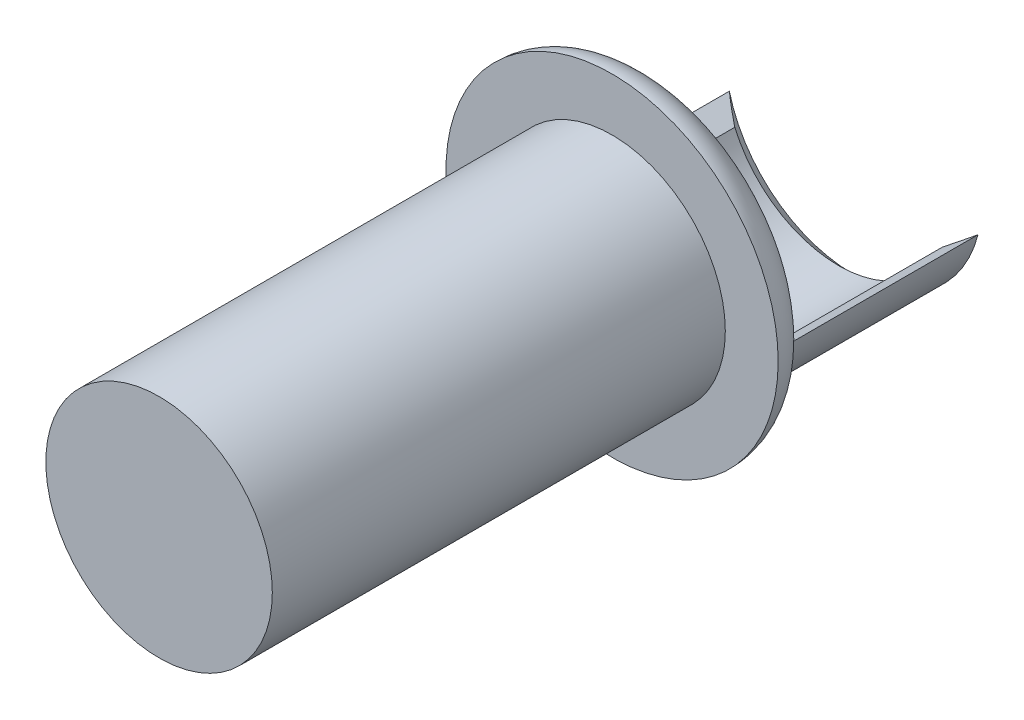
ISO-10303-21;
HEADER;
FILE_DESCRIPTION(('STEP AP214'),'2;1');
FILE_NAME('part.step','',(''),(''),'','','');
FILE_SCHEMA(('AUTOMOTIVE_DESIGN { 1 0 10303 214 1 1 1 1 }'));
ENDSEC;
DATA;
#1=APPLICATION_CONTEXT('core data for automotive mechanical design processes');
#2=APPLICATION_PROTOCOL_DEFINITION('international standard','automotive_design',2000,#1);
#3=PRODUCT_CONTEXT('',#1,'mechanical');
#4=PRODUCT('Part','Part','',(#3));
#5=PRODUCT_RELATED_PRODUCT_CATEGORY('part','',(#4));
#6=PRODUCT_DEFINITION_FORMATION('','',#4);
#7=PRODUCT_DEFINITION_CONTEXT('part definition',#1,'design');
#8=PRODUCT_DEFINITION('design','',#6,#7);
#9=PRODUCT_DEFINITION_SHAPE('','',#8);
#10=(LENGTH_UNIT() NAMED_UNIT(*) SI_UNIT(.MILLI.,.METRE.));
#11=(NAMED_UNIT(*) PLANE_ANGLE_UNIT() SI_UNIT($,.RADIAN.));
#12=(NAMED_UNIT(*) SI_UNIT($,.STERADIAN.) SOLID_ANGLE_UNIT());
#13=UNCERTAINTY_MEASURE_WITH_UNIT(LENGTH_MEASURE(1.E-05),#10,'distance_accuracy_value','');
#14=(GEOMETRIC_REPRESENTATION_CONTEXT(3) GLOBAL_UNCERTAINTY_ASSIGNED_CONTEXT((#13)) GLOBAL_UNIT_ASSIGNED_CONTEXT((#10,
#11,#12)) REPRESENTATION_CONTEXT('',''));
#15=CARTESIAN_POINT('',(0.,0.,0.));
#16=DIRECTION('',(0.,0.,1.));
#17=DIRECTION('',(1.,0.,0.));
#18=AXIS2_PLACEMENT_3D('',#15,#16,#17);
#19=CARTESIAN_POINT('',(0.,0.,65.));
#20=DIRECTION('',(0.,0.,-1.));
#21=DIRECTION('',(-1.,0.,0.));
#22=AXIS2_PLACEMENT_3D('',#19,#20,#21);
#23=CYLINDRICAL_SURFACE('',#22,15.);
#24=CARTESIAN_POINT('',(0.,0.,65.));
#25=DIRECTION('',(0.,0.,1.));
#26=DIRECTION('',(1.,0.,0.));
#27=AXIS2_PLACEMENT_3D('',#24,#25,#26);
#28=CIRCLE('',#27,15.);
#29=CARTESIAN_POINT('',(15.,0.,65.));
#30=VERTEX_POINT('',#29);
#31=EDGE_CURVE('E11',#30,#30,#28,.T.);
#32=ORIENTED_EDGE('',*,*,#31,.F.);
#33=EDGE_LOOP('',(#32));
#34=FACE_BOUND('',#33,.T.);
#35=CARTESIAN_POINT('',(0.,0.,5.));
#36=DIRECTION('',(0.,0.,1.));
#37=DIRECTION('',(1.,0.,0.));
#38=AXIS2_PLACEMENT_3D('',#35,#36,#37);
#39=CIRCLE('',#38,15.);
#40=CARTESIAN_POINT('',(15.,0.,5.));
#41=VERTEX_POINT('',#40);
#42=EDGE_CURVE('E45',#41,#41,#39,.T.);
#43=ORIENTED_EDGE('',*,*,#42,.T.);
#44=EDGE_LOOP('',(#43));
#45=FACE_BOUND('',#44,.T.);
#46=ADVANCED_FACE('F42',(#34,#45),#23,.T.);
#47=CARTESIAN_POINT('',(0.,0.,65.));
#48=DIRECTION('',(0.,0.,1.));
#49=DIRECTION('',(1.,0.,0.));
#50=AXIS2_PLACEMENT_3D('',#47,#48,#49);
#51=PLANE('',#50);
#52=ORIENTED_EDGE('',*,*,#31,.T.);
#53=EDGE_LOOP('',(#52));
#54=FACE_BOUND('',#53,.T.);
#55=ADVANCED_FACE('F57',(#54),#51,.T.);
#56=CARTESIAN_POINT('',(0.,0.,5.));
#57=DIRECTION('',(0.,0.,1.));
#58=DIRECTION('',(1.,0.,0.));
#59=AXIS2_PLACEMENT_3D('',#56,#57,#58);
#60=PLANE('',#59);
#61=ORIENTED_EDGE('',*,*,#42,.F.);
#62=EDGE_LOOP('',(#61));
#63=FACE_BOUND('',#62,.T.);
#64=ADVANCED_FACE('F55',(#63),#60,.F.);
#65=CLOSED_SHELL('',(#46,#55,#64));
#66=MANIFOLD_SOLID_BREP('B2',#65);
#67=CARTESIAN_POINT('',(0.,0.,0.));
#68=DIRECTION('',(0.,0.,1.));
#69=DIRECTION('',(1.,0.,0.));
#70=AXIS2_PLACEMENT_3D('',#67,#68,#69);
#71=PLANE('',#70);
#72=CARTESIAN_POINT('',(0.,0.,0.));
#73=DIRECTION('',(0.,0.,1.));
#74=DIRECTION('',(1.,0.,0.));
#75=AXIS2_PLACEMENT_3D('',#72,#73,#74);
#76=CIRCLE('',#75,15.);
#77=CARTESIAN_POINT('',(13.7477270848675,-6.00000000000001,0.));
#78=VERTEX_POINT('',#77);
#79=CARTESIAN_POINT('',(-13.7477270848675,-6.0000000000001,0.));
#80=VERTEX_POINT('',#79);
#81=EDGE_CURVE('E131',#78,#80,#76,.T.);
#82=ORIENTED_EDGE('',*,*,#81,.T.);
#83=DIRECTION('',(0.836660026534075,-0.547722557505167,0.));
#84=VECTOR('',#83,1.);
#85=CARTESIAN_POINT('',(-6.87386354243381,-10.5,0.));
#86=LINE('',#85,#84);
#87=CARTESIAN_POINT('',(-16.4681326651966,-4.2190765010232,0.));
#88=VERTEX_POINT('',#87);
#89=EDGE_CURVE('E141',#80,#88,#86,.F.);
#90=ORIENTED_EDGE('',*,*,#89,.T.);
#91=CARTESIAN_POINT('',(0.,0.,0.));
#92=DIRECTION('',(0.,0.,1.));
#93=DIRECTION('',(1.,0.,0.));
#94=AXIS2_PLACEMENT_3D('',#91,#92,#93);
#95=CIRCLE('',#94,17.);
#96=CARTESIAN_POINT('',(16.4681326651966,-4.21907650102318,0.));
#97=VERTEX_POINT('',#96);
#98=EDGE_CURVE('E136',#88,#97,#95,.F.);
#99=ORIENTED_EDGE('',*,*,#98,.T.);
#100=DIRECTION('',(0.836660026534082,0.547722557505157,0.));
#101=VECTOR('',#100,1.);
#102=CARTESIAN_POINT('',(6.87386354243359,-10.5,0.));
#103=LINE('',#102,#101);
#104=EDGE_CURVE('E144',#97,#78,#103,.F.);
#105=ORIENTED_EDGE('',*,*,#104,.T.);
#106=EDGE_LOOP('',(#82,#90,#99,#105));
#107=FACE_BOUND('',#106,.T.);
#108=ADVANCED_FACE('F82',(#107),#71,.F.);
#109=CARTESIAN_POINT('',(0.,0.,5.));
#110=DIRECTION('',(0.,0.,1.));
#111=DIRECTION('',(1.,0.,0.));
#112=AXIS2_PLACEMENT_3D('',#109,#110,#111);
#113=PLANE('',#112);
#114=CARTESIAN_POINT('',(0.,0.,5.));
#115=DIRECTION('',(0.,0.,1.));
#116=DIRECTION('',(1.,0.,0.));
#117=AXIS2_PLACEMENT_3D('',#114,#115,#116);
#118=CIRCLE('',#117,15.);
#119=CARTESIAN_POINT('',(15.,0.,5.));
#120=VERTEX_POINT('',#119);
#121=EDGE_CURVE('E146',#120,#120,#118,.T.);
#122=ORIENTED_EDGE('',*,*,#121,.F.);
#123=EDGE_LOOP('',(#122));
#124=FACE_BOUND('',#123,.T.);
#125=CARTESIAN_POINT('',(0.,0.,5.));
#126=DIRECTION('',(0.,0.,1.));
#127=DIRECTION('',(1.,0.,0.));
#128=AXIS2_PLACEMENT_3D('',#125,#126,#127);
#129=CIRCLE('',#128,22.);
#130=CARTESIAN_POINT('',(22.,0.,5.));
#131=VERTEX_POINT('',#130);
#132=EDGE_CURVE('E145',#131,#131,#129,.T.);
#133=ORIENTED_EDGE('',*,*,#132,.T.);
#134=EDGE_LOOP('',(#133));
#135=FACE_BOUND('',#134,.T.);
#136=ADVANCED_FACE('F176',(#124,#135),#113,.T.);
#137=CARTESIAN_POINT('',(0.,0.,0.));
#138=DIRECTION('',(0.,0.,1.));
#139=DIRECTION('',(1.,0.,0.));
#140=AXIS2_PLACEMENT_3D('',#137,#138,#139);
#141=CYLINDRICAL_SURFACE('',#140,15.);
#142=ORIENTED_EDGE('',*,*,#121,.T.);
#143=EDGE_LOOP('',(#142));
#144=FACE_BOUND('',#143,.T.);
#145=DIRECTION('',(0.,0.,1.));
#146=VECTOR('',#145,1.);
#147=CARTESIAN_POINT('',(13.7477270848675,-6.00000000000001,0.));
#148=LINE('',#147,#146);
#149=CARTESIAN_POINT('',(13.7477270848675,-6.00000000000001,-24.9999999999999));
#150=VERTEX_POINT('',#149);
#151=EDGE_CURVE('E150',#78,#150,#148,.F.);
#152=ORIENTED_EDGE('',*,*,#151,.T.);
#153=CARTESIAN_POINT('',(0.,0.,-24.9999999999999));
#154=DIRECTION('',(0.,0.,-1.));
#155=DIRECTION('',(-1.,0.,0.));
#156=AXIS2_PLACEMENT_3D('',#153,#154,#155);
#157=CIRCLE('',#156,15.);
#158=CARTESIAN_POINT('',(-13.7477270848675,-6.0000000000001,-24.9999999999999));
#159=VERTEX_POINT('',#158);
#160=EDGE_CURVE('E95',#150,#159,#157,.T.);
#161=ORIENTED_EDGE('',*,*,#160,.T.);
#162=DIRECTION('',(0.,0.,1.));
#163=VECTOR('',#162,1.);
#164=CARTESIAN_POINT('',(-13.7477270848675,-6.0000000000001,0.));
#165=LINE('',#164,#163);
#166=EDGE_CURVE('E128',#159,#80,#165,.T.);
#167=ORIENTED_EDGE('',*,*,#166,.T.);
#168=ORIENTED_EDGE('',*,*,#81,.F.);
#169=EDGE_LOOP('',(#152,#161,#167,#168));
#170=FACE_BOUND('',#169,.T.);
#171=ADVANCED_FACE('F130',(#144,#170),#141,.F.);
#172=CARTESIAN_POINT('',(0.,0.,-35.));
#173=DIRECTION('',(0.,0.,1.));
#174=DIRECTION('',(1.,0.,0.));
#175=AXIS2_PLACEMENT_3D('',#172,#173,#174);
#176=CYLINDRICAL_SURFACE('',#175,17.);
#177=DIRECTION('',(0.,0.,1.));
#178=VECTOR('',#177,1.);
#179=CARTESIAN_POINT('',(-16.4681326651966,-4.2190765010232,-17.5));
#180=LINE('',#179,#178);
#181=CARTESIAN_POINT('',(-16.4681326651966,-4.2190765010232,-26.9999999999999));
#182=VERTEX_POINT('',#181);
#183=EDGE_CURVE('E135',#88,#182,#180,.F.);
#184=ORIENTED_EDGE('',*,*,#183,.T.);
#185=CARTESIAN_POINT('',(0.,0.,-26.9999999999999));
#186=DIRECTION('',(0.,0.,-1.));
#187=DIRECTION('',(-1.,0.,0.));
#188=AXIS2_PLACEMENT_3D('',#185,#186,#187);
#189=CIRCLE('',#188,17.);
#190=CARTESIAN_POINT('',(16.4681326651966,-4.21907650102318,-26.9999999999999));
#191=VERTEX_POINT('',#190);
#192=EDGE_CURVE('E158',#182,#191,#189,.F.);
#193=ORIENTED_EDGE('',*,*,#192,.T.);
#194=DIRECTION('',(0.,0.,1.));
#195=VECTOR('',#194,1.);
#196=CARTESIAN_POINT('',(16.4681326651966,-4.21907650102318,-17.5));
#197=LINE('',#196,#195);
#198=EDGE_CURVE('E152',#191,#97,#197,.T.);
#199=ORIENTED_EDGE('',*,*,#198,.T.);
#200=EDGE_CURVE('E189',#97,#88,#95,.F.);
#201=ORIENTED_EDGE('',*,*,#200,.T.);
#202=EDGE_LOOP('',(#184,#193,#199,#201));
#203=FACE_BOUND('',#202,.T.);
#204=ADVANCED_FACE('F172',(#203),#176,.T.);
#205=CARTESIAN_POINT('',(0.,0.,5.));
#206=DIRECTION('',(0.,0.,1.));
#207=DIRECTION('',(1.,0.,0.));
#208=AXIS2_PLACEMENT_3D('',#205,#206,#207);
#209=TOROIDAL_SURFACE('',#208,17.,5.);
#210=ORIENTED_EDGE('',*,*,#98,.F.);
#211=ORIENTED_EDGE('',*,*,#200,.F.);
#212=EDGE_LOOP('',(#210,#211));
#213=FACE_BOUND('',#212,.T.);
#214=ORIENTED_EDGE('',*,*,#132,.F.);
#215=EDGE_LOOP('',(#214));
#216=FACE_BOUND('',#215,.T.);
#217=ADVANCED_FACE('F169',(#213,#216),#209,.T.);
#218=CARTESIAN_POINT('',(-13.7477270848675,-6.0000000000001,0.));
#219=DIRECTION('',(-0.547722557505167,-0.836660026534075,0.));
#220=DIRECTION('',(0.,0.,1.));
#221=AXIS2_PLACEMENT_3D('',#218,#219,#220);
#222=PLANE('',#221);
#223=ORIENTED_EDGE('',*,*,#166,.F.);
#224=CARTESIAN_POINT('',(-13.7477270848675,-6.0000000000001,-24.9999999999999));
#225=CARTESIAN_POINT('',(-13.9813171857133,-5.8470793830403,-25.1529551990735));
#226=CARTESIAN_POINT('',(-14.2129843495745,-5.69541762383612,-25.3100385722072));
#227=CARTESIAN_POINT('',(-14.6726819854894,-5.39447487906862,-25.631316207696));
#228=CARTESIAN_POINT('',(-14.9007143097886,-5.24519268092611,-25.7955066788798));
#229=CARTESIAN_POINT('',(-15.3535739512374,-4.94872645433614,-26.1299995114982));
#230=CARTESIAN_POINT('',(-15.5784015917281,-4.80154221421227,-26.3003012501411));
#231=CARTESIAN_POINT('',(-16.025294827102,-4.50898191726018,-26.6463144659804));
#232=CARTESIAN_POINT('',(-16.2473589047245,-4.36360685371225,-26.8220287454537));
#233=CARTESIAN_POINT('',(-16.4681326651966,-4.2190765010232,-26.9999999999999));
#234=B_SPLINE_CURVE_WITH_KNOTS('',3,(#224,#225,#226,#227,#228,#229,#230,#231,#232,#233),
.UNSPECIFIED.,.F.,.F.,(4,2,2,2,4),(0.,0.954957469603247,1.90941166269839,2.86376886323013,
3.81862876226726),.UNSPECIFIED.);
#235=EDGE_CURVE('E40',#159,#182,#234,.T.);
#236=ORIENTED_EDGE('',*,*,#235,.T.);
#237=ORIENTED_EDGE('',*,*,#183,.F.);
#238=ORIENTED_EDGE('',*,*,#89,.F.);
#239=EDGE_LOOP('',(#223,#236,#237,#238));
#240=FACE_BOUND('',#239,.T.);
#241=ADVANCED_FACE('F148',(#240),#222,.F.);
#242=CARTESIAN_POINT('',(22.9128784747794,0.,0.));
#243=DIRECTION('',(0.547722557505157,-0.836660026534082,0.));
#244=DIRECTION('',(0.,0.,1.));
#245=AXIS2_PLACEMENT_3D('',#242,#243,#244);
#246=PLANE('',#245);
#247=ORIENTED_EDGE('',*,*,#198,.F.);
#248=CARTESIAN_POINT('',(16.4681326651966,-4.21907650102318,-26.9999999999999));
#249=CARTESIAN_POINT('',(16.2473589047245,-4.36360685371223,-26.8220287454537));
#250=CARTESIAN_POINT('',(16.025294827102,-4.50898191726015,-26.6463144659804));
#251=CARTESIAN_POINT('',(15.5784015917281,-4.80154221421223,-26.3003012501411));
#252=CARTESIAN_POINT('',(15.3535739512374,-4.9487264543361,-26.1299995114982));
#253=CARTESIAN_POINT('',(14.9007143097886,-5.24519268092605,-25.7955066788798));
#254=CARTESIAN_POINT('',(14.6726819854894,-5.39447487906856,-25.631316207696));
#255=CARTESIAN_POINT('',(14.2129843495745,-5.69541762383604,-25.3100385722072));
#256=CARTESIAN_POINT('',(13.9813171857134,-5.84707938304022,-25.1529551990736));
#257=CARTESIAN_POINT('',(13.7477270848675,-6.00000000000001,-24.9999999999999));
#258=B_SPLINE_CURVE_WITH_KNOTS('',3,(#248,#249,#250,#251,#252,#253,#254,#255,#256,#257),
.UNSPECIFIED.,.F.,.F.,(4,2,2,2,4),(0.,0.954859899037113,1.90921709956883,2.86367129266397,
3.8186287622672),.UNSPECIFIED.);
#259=EDGE_CURVE('E108',#191,#150,#258,.T.);
#260=ORIENTED_EDGE('',*,*,#259,.T.);
#261=ORIENTED_EDGE('',*,*,#151,.F.);
#262=ORIENTED_EDGE('',*,*,#104,.F.);
#263=EDGE_LOOP('',(#247,#260,#261,#262));
#264=FACE_BOUND('',#263,.T.);
#265=ADVANCED_FACE('F163',(#264),#246,.F.);
#266=CARTESIAN_POINT('',(0.,0.,-35.));
#267=DIRECTION('',(0.,0.,-1.));
#268=DIRECTION('',(-1.,0.,0.));
#269=AXIS2_PLACEMENT_3D('',#266,#267,#268);
#270=CONICAL_SURFACE('',#269,25.0000000000002,0.785398163397453);
#271=ORIENTED_EDGE('',*,*,#235,.F.);
#272=ORIENTED_EDGE('',*,*,#160,.F.);
#273=ORIENTED_EDGE('',*,*,#259,.F.);
#274=ORIENTED_EDGE('',*,*,#192,.F.);
#275=EDGE_LOOP('',(#271,#272,#273,#274));
#276=FACE_BOUND('',#275,.T.);
#277=ADVANCED_FACE('F84',(#276),#270,.F.);
#278=CLOSED_SHELL('',(#108,#136,#171,#204,#217,#241,#265,#277));
#279=MANIFOLD_SOLID_BREP('B6',#278);
#280=ADVANCED_BREP_SHAPE_REPRESENTATION('',(#18,#66,#279),#14);
#281=SHAPE_DEFINITION_REPRESENTATION(#9,#280);
ENDSEC;
END-ISO-10303-21;
